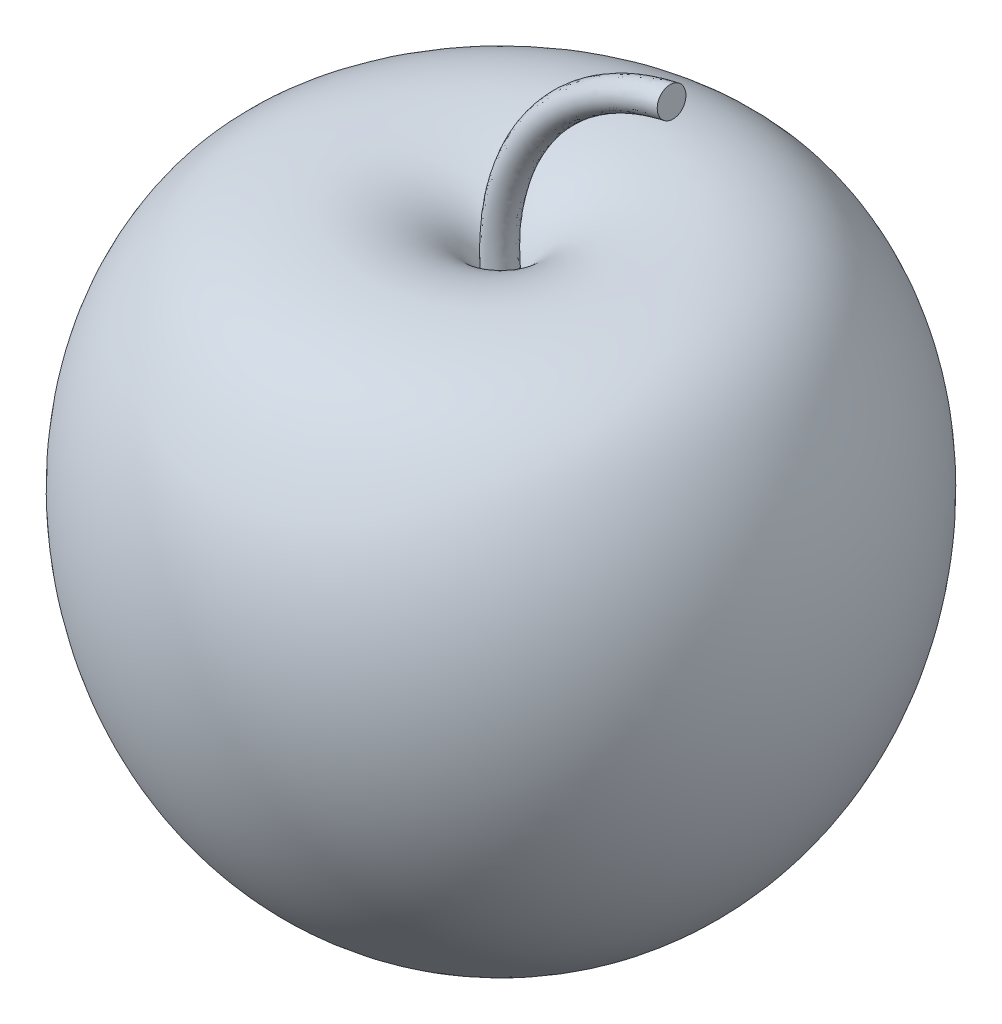
ISO-10303-21;
HEADER;
FILE_DESCRIPTION(('STEP AP214'),'2;1');
FILE_NAME('part.step','',(''),(''),'','','');
FILE_SCHEMA(('AUTOMOTIVE_DESIGN { 1 0 10303 214 1 1 1 1 }'));
ENDSEC;
DATA;
#1=APPLICATION_CONTEXT('core data for automotive mechanical design processes');
#2=APPLICATION_PROTOCOL_DEFINITION('international standard','automotive_design',2000,#1);
#3=PRODUCT_CONTEXT('',#1,'mechanical');
#4=PRODUCT('Part','Part','',(#3));
#5=PRODUCT_RELATED_PRODUCT_CATEGORY('part','',(#4));
#6=PRODUCT_DEFINITION_FORMATION('','',#4);
#7=PRODUCT_DEFINITION_CONTEXT('part definition',#1,'design');
#8=PRODUCT_DEFINITION('design','',#6,#7);
#9=PRODUCT_DEFINITION_SHAPE('','',#8);
#10=(LENGTH_UNIT() NAMED_UNIT(*) SI_UNIT(.MILLI.,.METRE.));
#11=(NAMED_UNIT(*) PLANE_ANGLE_UNIT() SI_UNIT($,.RADIAN.));
#12=(NAMED_UNIT(*) SI_UNIT($,.STERADIAN.) SOLID_ANGLE_UNIT());
#13=UNCERTAINTY_MEASURE_WITH_UNIT(LENGTH_MEASURE(1.E-05),#10,'distance_accuracy_value','');
#14=(GEOMETRIC_REPRESENTATION_CONTEXT(3) GLOBAL_UNCERTAINTY_ASSIGNED_CONTEXT((#13)) GLOBAL_UNIT_ASSIGNED_CONTEXT((#10,
#11,#12)) REPRESENTATION_CONTEXT('',''));
#15=CARTESIAN_POINT('',(0.,0.,0.));
#16=DIRECTION('',(0.,0.,1.));
#17=DIRECTION('',(1.,0.,0.));
#18=AXIS2_PLACEMENT_3D('',#15,#16,#17);
#19=CARTESIAN_POINT('',(0.,0.,0.));
#20=DIRECTION('',(0.,1.,0.));
#21=DIRECTION('',(0.,0.,1.));
#22=AXIS2_PLACEMENT_3D('',#19,#20,#21);
#23=PLANE('',#22);
#24=CARTESIAN_POINT('',(0.,0.,0.));
#25=DIRECTION('',(0.,1.,0.));
#26=DIRECTION('',(0.,0.,1.));
#27=AXIS2_PLACEMENT_3D('',#24,#25,#26);
#28=CIRCLE('',#27,2.);
#29=CARTESIAN_POINT('',(0.,0.,2.));
#30=VERTEX_POINT('',#29);
#31=EDGE_CURVE('E51',#30,#30,#28,.T.);
#32=ORIENTED_EDGE('',*,*,#31,.F.);
#33=EDGE_LOOP('',(#32));
#34=FACE_BOUND('',#33,.T.);
#35=ADVANCED_FACE('F44',(#34),#23,.F.);
#36=CARTESIAN_POINT('',(23.8785900051568,33.3188332118925,0.));
#37=DIRECTION('',(0.994707765173006,0.102744644164662,0.));
#38=DIRECTION('',(0.,0.,1.));
#39=AXIS2_PLACEMENT_3D('',#36,#37,#38);
#40=PLANE('',#39);
#41=CARTESIAN_POINT('',(23.8785900051568,33.3188332118925,0.));
#42=DIRECTION('',(0.994707765173006,0.102744644164662,0.));
#43=DIRECTION('',(0.,0.,1.));
#44=AXIS2_PLACEMENT_3D('',#41,#42,#43);
#45=CIRCLE('',#44,2.);
#46=CARTESIAN_POINT('',(23.8785900051568,33.3188332118925,2.));
#47=VERTEX_POINT('',#46);
#48=EDGE_CURVE('E12',#47,#47,#45,.T.);
#49=ORIENTED_EDGE('',*,*,#48,.T.);
#50=EDGE_LOOP('',(#49));
#51=FACE_BOUND('',#50,.T.);
#52=ADVANCED_FACE('F58',(#51),#40,.T.);
#53=CARTESIAN_POINT('',(0.,0.,2.));
#54=CARTESIAN_POINT('',(-1.8453787950608,16.3915731685534,2.));
#55=CARTESIAN_POINT('',(7.76336767864276,29.7990742422579,2.));
#56=CARTESIAN_POINT('',(23.8785900051568,33.3188332118925,2.));
#57=CARTESIAN_POINT('',(4.,0.,2.));
#58=CARTESIAN_POINT('',(2.1546212049392,14.235363074718,2.));
#59=CARTESIAN_POINT('',(10.3191451789839,26.0417822204012,2.));
#60=CARTESIAN_POINT('',(24.2895685818154,29.3400021512005,2.));
#61=CARTESIAN_POINT('',(4.,0.,-2.));
#62=CARTESIAN_POINT('',(2.1546212049392,14.235363074718,-2.));
#63=CARTESIAN_POINT('',(10.3191451789839,26.0417822204012,-2.));
#64=CARTESIAN_POINT('',(24.2895685818154,29.3400021512005,-2.));
#65=CARTESIAN_POINT('',(0.,0.,-2.));
#66=CARTESIAN_POINT('',(-1.8453787950608,16.3915731685534,-2.));
#67=CARTESIAN_POINT('',(7.76336767864276,29.7990742422579,-2.));
#68=CARTESIAN_POINT('',(23.8785900051568,33.3188332118925,-2.));
#69=CARTESIAN_POINT('',(-4.,0.,-2.));
#70=CARTESIAN_POINT('',(-5.8453787950608,18.5477832623887,-2.));
#71=CARTESIAN_POINT('',(5.20759017830167,33.5563662641145,-2.));
#72=CARTESIAN_POINT('',(23.4676114284981,37.2976642725845,-2.));
#73=CARTESIAN_POINT('',(-4.,0.,2.));
#74=CARTESIAN_POINT('',(-5.8453787950608,18.5477832623887,2.));
#75=CARTESIAN_POINT('',(5.20759017830167,33.5563662641145,2.));
#76=CARTESIAN_POINT('',(23.4676114284981,37.2976642725845,2.));
#77=CARTESIAN_POINT('',(0.,0.,2.));
#78=CARTESIAN_POINT('',(-1.8453787950608,16.3915731685534,2.));
#79=CARTESIAN_POINT('',(7.76336767864276,29.7990742422579,2.));
#80=CARTESIAN_POINT('',(23.8785900051568,33.3188332118925,2.));
#81=(BOUNDED_SURFACE() B_SPLINE_SURFACE(3,3,((#53,#54,#55,#56),(#57,#58,#59,#60),(#61,#62,#63,
#64),(#65,#66,#67,#68),(#69,#70,#71,#72),(#73,#74,#75,#76),(#77,#78,#79,#80)),.UNSPECIFIED.,.T.,
.F.,.F.) B_SPLINE_SURFACE_WITH_KNOTS((4,3,4),(4,4),(0.,0.5,1.),(0.,1.),
.UNSPECIFIED.) GEOMETRIC_REPRESENTATION_ITEM() RATIONAL_B_SPLINE_SURFACE(((1.,0.828362994434489,
0.828362994434489,1.),(0.333333333333333,0.27612099814483,0.27612099814483,0.333333333333333),
(0.333333333333333,0.27612099814483,0.27612099814483,0.333333333333333),(1.,0.828362994434489,
0.828362994434489,1.),(0.333333333333333,0.27612099814483,0.27612099814483,0.333333333333333),
(0.333333333333333,0.27612099814483,0.27612099814483,0.333333333333333),(1.,0.828362994434489,
0.828362994434489,1.))) REPRESENTATION_ITEM('') SURFACE());
#82=ORIENTED_EDGE('',*,*,#48,.F.);
#83=EDGE_LOOP('',(#82));
#84=FACE_BOUND('',#83,.T.);
#85=ORIENTED_EDGE('',*,*,#31,.T.);
#86=EDGE_LOOP('',(#85));
#87=FACE_BOUND('',#86,.T.);
#88=ADVANCED_FACE('F60',(#84,#87),#81,.T.);
#89=CLOSED_SHELL('',(#35,#52,#88));
#90=MANIFOLD_SOLID_BREP('B2',#89);
#91=CARTESIAN_POINT('',(0.,0.,0.));
#92=DIRECTION('',(0.,1.,0.));
#93=DIRECTION('',(-1.,0.,0.));
#94=AXIS2_PLACEMENT_3D('',#91,#92,#93);
#95=PLANE('',#94);
#96=CARTESIAN_POINT('',(0.,0.,0.));
#97=DIRECTION('',(0.,1.,0.));
#98=DIRECTION('',(-1.,0.,0.));
#99=AXIS2_PLACEMENT_3D('',#96,#97,#98);
#100=CIRCLE('',#99,2.);
#101=CARTESIAN_POINT('',(-2.,0.,0.));
#102=VERTEX_POINT('',#101);
#103=EDGE_CURVE('E42',#102,#102,#100,.T.);
#104=ORIENTED_EDGE('',*,*,#103,.T.);
#105=EDGE_LOOP('',(#104));
#106=FACE_BOUND('',#105,.T.);
#107=ADVANCED_FACE('F93',(#106),#95,.T.);
#108=CARTESIAN_POINT('',(-2.,0.,0.));
#109=CARTESIAN_POINT('',(-5.79394317288756,9.38352576157773,0.));
#110=CARTESIAN_POINT('',(-27.7660076047517,11.2279143086889,0.));
#111=CARTESIAN_POINT('',(-57.1318925372974,-20.0114966699168,0.));
#112=CARTESIAN_POINT('',(-39.8677785380898,-75.,0.));
#113=CARTESIAN_POINT('',(0.,-75.,0.));
#114=B_SPLINE_CURVE_WITH_KNOTS('',3,(#108,#109,#110,#111,#112,#113),.UNSPECIFIED.,.F.,.F.,(4,1,
1,4),(0.,0.180102704384575,0.280102704384575,1.),.UNSPECIFIED.);
#115=CARTESIAN_POINT('',(0.,0.,0.));
#116=DIRECTION('',(0.,1.,0.));
#117=AXIS1_PLACEMENT('',#115,#116);
#118=SURFACE_OF_REVOLUTION('',#114,#117);
#119=CARTESIAN_POINT('',(0.,-75.,0.));
#120=VERTEX_POINT('',#119);
#121=VERTEX_LOOP('',#120);
#122=FACE_BOUND('',#121,.T.);
#123=ORIENTED_EDGE('',*,*,#103,.F.);
#124=EDGE_LOOP('',(#123));
#125=FACE_BOUND('',#124,.T.);
#126=ADVANCED_FACE('F101',(#122,#125),#118,.F.);
#127=CLOSED_SHELL('',(#107,#126));
#128=MANIFOLD_SOLID_BREP('B6',#127);
#129=ADVANCED_BREP_SHAPE_REPRESENTATION('',(#18,#90,#128),#14);
#130=SHAPE_DEFINITION_REPRESENTATION(#9,#129);
ENDSEC;
END-ISO-10303-21;
